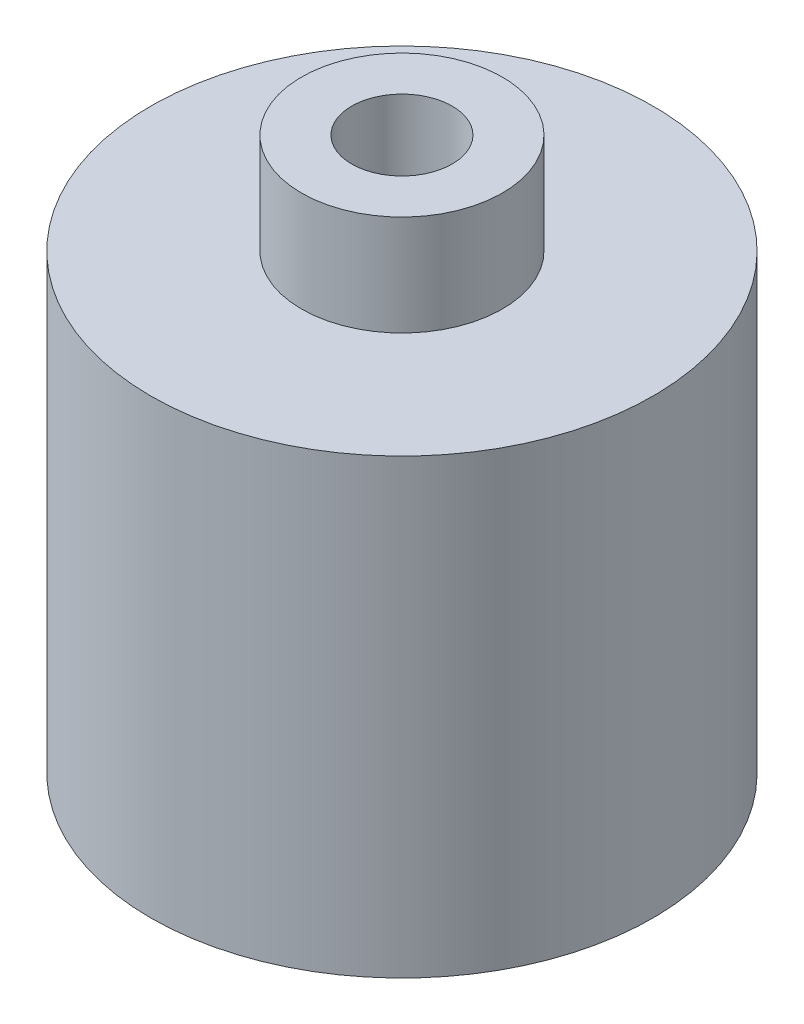
ISO-10303-21;
HEADER;
FILE_DESCRIPTION(('STEP AP214'),'2;1');
FILE_NAME('part.step','',(''),(''),'','','');
FILE_SCHEMA(('AUTOMOTIVE_DESIGN { 1 0 10303 214 1 1 1 1 }'));
ENDSEC;
DATA;
#1=APPLICATION_CONTEXT('core data for automotive mechanical design processes');
#2=APPLICATION_PROTOCOL_DEFINITION('international standard','automotive_design',2000,#1);
#3=PRODUCT_CONTEXT('',#1,'mechanical');
#4=PRODUCT('Part','Part','',(#3));
#5=PRODUCT_RELATED_PRODUCT_CATEGORY('part','',(#4));
#6=PRODUCT_DEFINITION_FORMATION('','',#4);
#7=PRODUCT_DEFINITION_CONTEXT('part definition',#1,'design');
#8=PRODUCT_DEFINITION('design','',#6,#7);
#9=PRODUCT_DEFINITION_SHAPE('','',#8);
#10=(LENGTH_UNIT() NAMED_UNIT(*) SI_UNIT(.MILLI.,.METRE.));
#11=(NAMED_UNIT(*) PLANE_ANGLE_UNIT() SI_UNIT($,.RADIAN.));
#12=(NAMED_UNIT(*) SI_UNIT($,.STERADIAN.) SOLID_ANGLE_UNIT());
#13=UNCERTAINTY_MEASURE_WITH_UNIT(LENGTH_MEASURE(1.E-05),#10,'distance_accuracy_value','');
#14=(GEOMETRIC_REPRESENTATION_CONTEXT(3) GLOBAL_UNCERTAINTY_ASSIGNED_CONTEXT((#13)) GLOBAL_UNIT_ASSIGNED_CONTEXT((#10,
#11,#12)) REPRESENTATION_CONTEXT('',''));
#15=CARTESIAN_POINT('',(0.,0.,0.));
#16=DIRECTION('',(0.,0.,1.));
#17=DIRECTION('',(1.,0.,0.));
#18=AXIS2_PLACEMENT_3D('',#15,#16,#17);
#19=CARTESIAN_POINT('',(0.,28.575,0.));
#20=DIRECTION('',(0.,1.,0.));
#21=DIRECTION('',(0.,0.,1.));
#22=AXIS2_PLACEMENT_3D('',#19,#20,#21);
#23=PLANE('',#22);
#24=CARTESIAN_POINT('',(0.,28.575,0.));
#25=DIRECTION('',(0.,1.,0.));
#26=DIRECTION('',(0.,0.,1.));
#27=AXIS2_PLACEMENT_3D('',#24,#25,#26);
#28=CIRCLE('',#27,15.875);
#29=CARTESIAN_POINT('',(0.,28.575,15.875));
#30=VERTEX_POINT('',#29);
#31=EDGE_CURVE('E55',#30,#30,#28,.T.);
#32=ORIENTED_EDGE('',*,*,#31,.T.);
#33=EDGE_LOOP('',(#32));
#34=FACE_BOUND('',#33,.T.);
#35=CARTESIAN_POINT('',(0.,28.575,0.));
#36=DIRECTION('',(0.,1.,0.));
#37=DIRECTION('',(0.,0.,1.));
#38=AXIS2_PLACEMENT_3D('',#35,#36,#37);
#39=CIRCLE('',#38,6.35);
#40=CARTESIAN_POINT('',(0.,28.575,6.35));
#41=VERTEX_POINT('',#40);
#42=EDGE_CURVE('E66',#41,#41,#39,.T.);
#43=ORIENTED_EDGE('',*,*,#42,.F.);
#44=EDGE_LOOP('',(#43));
#45=FACE_BOUND('',#44,.T.);
#46=ADVANCED_FACE('F37',(#34,#45),#23,.T.);
#47=CARTESIAN_POINT('',(0.,0.,0.));
#48=DIRECTION('',(0.,1.,0.));
#49=DIRECTION('',(0.,0.,1.));
#50=AXIS2_PLACEMENT_3D('',#47,#48,#49);
#51=PLANE('',#50);
#52=CARTESIAN_POINT('',(0.,0.,0.));
#53=DIRECTION('',(0.,1.,0.));
#54=DIRECTION('',(0.,0.,1.));
#55=AXIS2_PLACEMENT_3D('',#52,#53,#54);
#56=CIRCLE('',#55,15.875);
#57=CARTESIAN_POINT('',(0.,0.,15.875));
#58=VERTEX_POINT('',#57);
#59=EDGE_CURVE('E10',#58,#58,#56,.T.);
#60=ORIENTED_EDGE('',*,*,#59,.F.);
#61=EDGE_LOOP('',(#60));
#62=FACE_BOUND('',#61,.T.);
#63=CARTESIAN_POINT('',(0.,0.,0.));
#64=DIRECTION('',(0.,1.,0.));
#65=DIRECTION('',(0.,0.,1.));
#66=AXIS2_PLACEMENT_3D('',#63,#64,#65);
#67=CIRCLE('',#66,12.7);
#68=CARTESIAN_POINT('',(0.,0.,12.7));
#69=VERTEX_POINT('',#68);
#70=EDGE_CURVE('E45',#69,#69,#67,.T.);
#71=ORIENTED_EDGE('',*,*,#70,.T.);
#72=EDGE_LOOP('',(#71));
#73=FACE_BOUND('',#72,.T.);
#74=ADVANCED_FACE('F95',(#62,#73),#51,.F.);
#75=CARTESIAN_POINT('',(0.,25.4,0.));
#76=DIRECTION('',(0.,-1.,0.));
#77=DIRECTION('',(0.,0.,-1.));
#78=AXIS2_PLACEMENT_3D('',#75,#76,#77);
#79=CYLINDRICAL_SURFACE('',#78,15.875);
#80=ORIENTED_EDGE('',*,*,#59,.T.);
#81=EDGE_LOOP('',(#80));
#82=FACE_BOUND('',#81,.T.);
#83=ORIENTED_EDGE('',*,*,#31,.F.);
#84=EDGE_LOOP('',(#83));
#85=FACE_BOUND('',#84,.T.);
#86=ADVANCED_FACE('F39',(#82,#85),#79,.T.);
#87=CARTESIAN_POINT('',(0.,25.4,0.));
#88=DIRECTION('',(0.,-1.,0.));
#89=DIRECTION('',(0.,0.,-1.));
#90=AXIS2_PLACEMENT_3D('',#87,#88,#89);
#91=CYLINDRICAL_SURFACE('',#90,12.7);
#92=CARTESIAN_POINT('',(0.,25.4,0.));
#93=DIRECTION('',(0.,1.,0.));
#94=DIRECTION('',(0.,0.,1.));
#95=AXIS2_PLACEMENT_3D('',#92,#93,#94);
#96=CIRCLE('',#95,12.7);
#97=CARTESIAN_POINT('',(0.,25.4,12.7));
#98=VERTEX_POINT('',#97);
#99=EDGE_CURVE('E50',#98,#98,#96,.T.);
#100=ORIENTED_EDGE('',*,*,#99,.T.);
#101=EDGE_LOOP('',(#100));
#102=FACE_BOUND('',#101,.T.);
#103=ORIENTED_EDGE('',*,*,#70,.F.);
#104=EDGE_LOOP('',(#103));
#105=FACE_BOUND('',#104,.T.);
#106=ADVANCED_FACE('F106',(#102,#105),#91,.F.);
#107=CARTESIAN_POINT('',(0.,25.4,0.));
#108=DIRECTION('',(0.,1.,0.));
#109=DIRECTION('',(0.,0.,1.));
#110=AXIS2_PLACEMENT_3D('',#107,#108,#109);
#111=PLANE('',#110);
#112=CARTESIAN_POINT('',(0.,25.4,0.));
#113=DIRECTION('',(0.,1.,0.));
#114=DIRECTION('',(0.,0.,1.));
#115=AXIS2_PLACEMENT_3D('',#112,#113,#114);
#116=CIRCLE('',#115,3.175);
#117=CARTESIAN_POINT('',(0.,25.4,3.175));
#118=VERTEX_POINT('',#117);
#119=EDGE_CURVE('E61',#118,#118,#116,.T.);
#120=ORIENTED_EDGE('',*,*,#119,.T.);
#121=EDGE_LOOP('',(#120));
#122=FACE_BOUND('',#121,.T.);
#123=ORIENTED_EDGE('',*,*,#99,.F.);
#124=EDGE_LOOP('',(#123));
#125=FACE_BOUND('',#124,.T.);
#126=ADVANCED_FACE('F91',(#122,#125),#111,.F.);
#127=CARTESIAN_POINT('',(0.,28.575,0.));
#128=DIRECTION('',(0.,-1.,0.));
#129=DIRECTION('',(0.,0.,-1.));
#130=AXIS2_PLACEMENT_3D('',#127,#128,#129);
#131=CYLINDRICAL_SURFACE('',#130,3.175);
#132=ORIENTED_EDGE('',*,*,#119,.F.);
#133=EDGE_LOOP('',(#132));
#134=FACE_BOUND('',#133,.T.);
#135=CARTESIAN_POINT('',(0.,34.925,0.));
#136=DIRECTION('',(0.,1.,0.));
#137=DIRECTION('',(0.,0.,1.));
#138=AXIS2_PLACEMENT_3D('',#135,#136,#137);
#139=CIRCLE('',#138,3.175);
#140=CARTESIAN_POINT('',(0.,34.925,3.175));
#141=VERTEX_POINT('',#140);
#142=EDGE_CURVE('E70',#141,#141,#139,.T.);
#143=ORIENTED_EDGE('',*,*,#142,.T.);
#144=EDGE_LOOP('',(#143));
#145=FACE_BOUND('',#144,.T.);
#146=ADVANCED_FACE('F78',(#134,#145),#131,.F.);
#147=CARTESIAN_POINT('',(0.,34.925,0.));
#148=DIRECTION('',(0.,1.,0.));
#149=DIRECTION('',(0.,0.,1.));
#150=AXIS2_PLACEMENT_3D('',#147,#148,#149);
#151=PLANE('',#150);
#152=CARTESIAN_POINT('',(0.,34.925,0.));
#153=DIRECTION('',(0.,1.,0.));
#154=DIRECTION('',(0.,0.,1.));
#155=AXIS2_PLACEMENT_3D('',#152,#153,#154);
#156=CIRCLE('',#155,6.35);
#157=CARTESIAN_POINT('',(0.,34.925,6.35));
#158=VERTEX_POINT('',#157);
#159=EDGE_CURVE('E65',#158,#158,#156,.T.);
#160=ORIENTED_EDGE('',*,*,#159,.T.);
#161=EDGE_LOOP('',(#160));
#162=FACE_BOUND('',#161,.T.);
#163=ORIENTED_EDGE('',*,*,#142,.F.);
#164=EDGE_LOOP('',(#163));
#165=FACE_BOUND('',#164,.T.);
#166=ADVANCED_FACE('F80',(#162,#165),#151,.T.);
#167=CARTESIAN_POINT('',(0.,34.925,0.));
#168=DIRECTION('',(0.,-1.,0.));
#169=DIRECTION('',(0.,0.,-1.));
#170=AXIS2_PLACEMENT_3D('',#167,#168,#169);
#171=CYLINDRICAL_SURFACE('',#170,6.35);
#172=ORIENTED_EDGE('',*,*,#159,.F.);
#173=EDGE_LOOP('',(#172));
#174=FACE_BOUND('',#173,.T.);
#175=ORIENTED_EDGE('',*,*,#42,.T.);
#176=EDGE_LOOP('',(#175));
#177=FACE_BOUND('',#176,.T.);
#178=ADVANCED_FACE('F82',(#174,#177),#171,.T.);
#179=CLOSED_SHELL('',(#46,#74,#86,#106,#126,#146,#166,#178));
#180=MANIFOLD_SOLID_BREP('B2',#179);
#181=ADVANCED_BREP_SHAPE_REPRESENTATION('',(#18,#180),#14);
#182=SHAPE_DEFINITION_REPRESENTATION(#9,#181);
ENDSEC;
END-ISO-10303-21;
